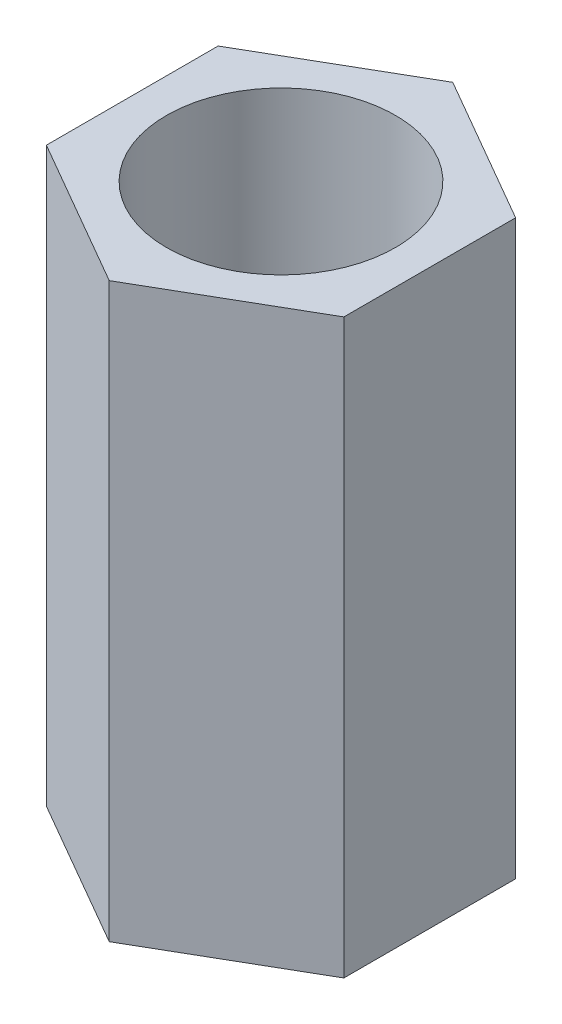
ISO-10303-21;
HEADER;
FILE_DESCRIPTION(('STEP AP214'),'2;1');
FILE_NAME('part.step','',(''),(''),'','','');
FILE_SCHEMA(('AUTOMOTIVE_DESIGN { 1 0 10303 214 1 1 1 1 }'));
ENDSEC;
DATA;
#1=APPLICATION_CONTEXT('core data for automotive mechanical design processes');
#2=APPLICATION_PROTOCOL_DEFINITION('international standard','automotive_design',2000,#1);
#3=PRODUCT_CONTEXT('',#1,'mechanical');
#4=PRODUCT('Part','Part','',(#3));
#5=PRODUCT_RELATED_PRODUCT_CATEGORY('part','',(#4));
#6=PRODUCT_DEFINITION_FORMATION('','',#4);
#7=PRODUCT_DEFINITION_CONTEXT('part definition',#1,'design');
#8=PRODUCT_DEFINITION('design','',#6,#7);
#9=PRODUCT_DEFINITION_SHAPE('','',#8);
#10=(LENGTH_UNIT() NAMED_UNIT(*) SI_UNIT(.MILLI.,.METRE.));
#11=(NAMED_UNIT(*) PLANE_ANGLE_UNIT() SI_UNIT($,.RADIAN.));
#12=(NAMED_UNIT(*) SI_UNIT($,.STERADIAN.) SOLID_ANGLE_UNIT());
#13=UNCERTAINTY_MEASURE_WITH_UNIT(LENGTH_MEASURE(1.E-05),#10,'distance_accuracy_value','');
#14=(GEOMETRIC_REPRESENTATION_CONTEXT(3) GLOBAL_UNCERTAINTY_ASSIGNED_CONTEXT((#13)) GLOBAL_UNIT_ASSIGNED_CONTEXT((#10,
#11,#12)) REPRESENTATION_CONTEXT('',''));
#15=CARTESIAN_POINT('',(0.,0.,0.));
#16=DIRECTION('',(0.,0.,1.));
#17=DIRECTION('',(1.,0.,0.));
#18=AXIS2_PLACEMENT_3D('',#15,#16,#17);
#19=CARTESIAN_POINT('',(0.,10.,0.));
#20=DIRECTION('',(0.,1.,0.));
#21=DIRECTION('',(0.,0.,1.));
#22=AXIS2_PLACEMENT_3D('',#19,#20,#21);
#23=PLANE('',#22);
#24=DIRECTION('',(-0.866025403784439,0.,-0.5));
#25=VECTOR('',#24,1.);
#26=CARTESIAN_POINT('',(2.59807621135331,10.,-1.5));
#27=LINE('',#26,#25);
#28=CARTESIAN_POINT('',(2.59807621135331,10.,-1.5));
#29=VERTEX_POINT('',#28);
#30=CARTESIAN_POINT('',(0.,10.,-3.));
#31=VERTEX_POINT('',#30);
#32=EDGE_CURVE('E150',#29,#31,#27,.T.);
#33=ORIENTED_EDGE('',*,*,#32,.T.);
#34=DIRECTION('',(-0.866025403784439,0.,0.5));
#35=VECTOR('',#34,1.);
#36=CARTESIAN_POINT('',(0.,10.,-3.));
#37=LINE('',#36,#35);
#38=CARTESIAN_POINT('',(-2.59807621135332,10.,-1.5));
#39=VERTEX_POINT('',#38);
#40=EDGE_CURVE('E98',#31,#39,#37,.T.);
#41=ORIENTED_EDGE('',*,*,#40,.T.);
#42=DIRECTION('',(0.,0.,1.));
#43=VECTOR('',#42,1.);
#44=CARTESIAN_POINT('',(-2.59807621135332,10.,-1.5));
#45=LINE('',#44,#43);
#46=CARTESIAN_POINT('',(-2.59807621135332,10.,1.5));
#47=VERTEX_POINT('',#46);
#48=EDGE_CURVE('E111',#39,#47,#45,.T.);
#49=ORIENTED_EDGE('',*,*,#48,.T.);
#50=DIRECTION('',(0.866025403784439,0.,0.5));
#51=VECTOR('',#50,1.);
#52=CARTESIAN_POINT('',(-2.59807621135332,10.,1.5));
#53=LINE('',#52,#51);
#54=CARTESIAN_POINT('',(0.,10.,3.));
#55=VERTEX_POINT('',#54);
#56=EDGE_CURVE('E105',#47,#55,#53,.T.);
#57=ORIENTED_EDGE('',*,*,#56,.T.);
#58=DIRECTION('',(0.866025403784439,0.,-0.5));
#59=VECTOR('',#58,1.);
#60=CARTESIAN_POINT('',(0.,10.,3.));
#61=LINE('',#60,#59);
#62=CARTESIAN_POINT('',(2.59807621135332,10.,1.5));
#63=VERTEX_POINT('',#62);
#64=EDGE_CURVE('E109',#55,#63,#61,.T.);
#65=ORIENTED_EDGE('',*,*,#64,.T.);
#66=DIRECTION('',(0.,0.,-1.));
#67=VECTOR('',#66,1.);
#68=CARTESIAN_POINT('',(2.59807621135332,10.,1.5));
#69=LINE('',#68,#67);
#70=EDGE_CURVE('E61',#63,#29,#69,.T.);
#71=ORIENTED_EDGE('',*,*,#70,.T.);
#72=EDGE_LOOP('',(#33,#41,#49,#57,#65,#71));
#73=FACE_BOUND('',#72,.T.);
#74=CARTESIAN_POINT('',(0.,10.,0.));
#75=DIRECTION('',(0.,1.,0.));
#76=DIRECTION('',(0.,0.,1.));
#77=AXIS2_PLACEMENT_3D('',#74,#75,#76);
#78=CIRCLE('',#77,2.);
#79=CARTESIAN_POINT('',(0.,10.,2.));
#80=VERTEX_POINT('',#79);
#81=EDGE_CURVE('E138',#80,#80,#78,.T.);
#82=ORIENTED_EDGE('',*,*,#81,.F.);
#83=EDGE_LOOP('',(#82));
#84=FACE_BOUND('',#83,.T.);
#85=ADVANCED_FACE('F43',(#73,#84),#23,.T.);
#86=CARTESIAN_POINT('',(0.,0.,0.));
#87=DIRECTION('',(0.,1.,0.));
#88=DIRECTION('',(0.,0.,1.));
#89=AXIS2_PLACEMENT_3D('',#86,#87,#88);
#90=PLANE('',#89);
#91=DIRECTION('',(-0.866025403784439,0.,-0.5));
#92=VECTOR('',#91,1.);
#93=CARTESIAN_POINT('',(2.59807621135331,0.,-1.5));
#94=LINE('',#93,#92);
#95=CARTESIAN_POINT('',(2.59807621135331,0.,-1.5));
#96=VERTEX_POINT('',#95);
#97=CARTESIAN_POINT('',(0.,0.,-3.));
#98=VERTEX_POINT('',#97);
#99=EDGE_CURVE('E133',#96,#98,#94,.T.);
#100=ORIENTED_EDGE('',*,*,#99,.F.);
#101=DIRECTION('',(0.,0.,-1.));
#102=VECTOR('',#101,1.);
#103=CARTESIAN_POINT('',(2.59807621135332,0.,1.5));
#104=LINE('',#103,#102);
#105=CARTESIAN_POINT('',(2.59807621135332,0.,1.5));
#106=VERTEX_POINT('',#105);
#107=EDGE_CURVE('E90',#106,#96,#104,.T.);
#108=ORIENTED_EDGE('',*,*,#107,.F.);
#109=DIRECTION('',(0.866025403784439,0.,-0.5));
#110=VECTOR('',#109,1.);
#111=CARTESIAN_POINT('',(0.,0.,3.));
#112=LINE('',#111,#110);
#113=CARTESIAN_POINT('',(0.,0.,3.));
#114=VERTEX_POINT('',#113);
#115=EDGE_CURVE('E84',#114,#106,#112,.T.);
#116=ORIENTED_EDGE('',*,*,#115,.F.);
#117=DIRECTION('',(0.866025403784439,0.,0.5));
#118=VECTOR('',#117,1.);
#119=CARTESIAN_POINT('',(-2.59807621135332,0.,1.5));
#120=LINE('',#119,#118);
#121=CARTESIAN_POINT('',(-2.59807621135332,0.,1.5));
#122=VERTEX_POINT('',#121);
#123=EDGE_CURVE('E120',#122,#114,#120,.T.);
#124=ORIENTED_EDGE('',*,*,#123,.F.);
#125=DIRECTION('',(0.,0.,1.));
#126=VECTOR('',#125,1.);
#127=CARTESIAN_POINT('',(-2.59807621135332,0.,-1.5));
#128=LINE('',#127,#126);
#129=CARTESIAN_POINT('',(-2.59807621135332,0.,-1.5));
#130=VERTEX_POINT('',#129);
#131=EDGE_CURVE('E141',#130,#122,#128,.T.);
#132=ORIENTED_EDGE('',*,*,#131,.F.);
#133=DIRECTION('',(-0.866025403784439,0.,0.5));
#134=VECTOR('',#133,1.);
#135=CARTESIAN_POINT('',(0.,0.,-3.));
#136=LINE('',#135,#134);
#137=EDGE_CURVE('E137',#98,#130,#136,.T.);
#138=ORIENTED_EDGE('',*,*,#137,.F.);
#139=EDGE_LOOP('',(#100,#108,#116,#124,#132,#138));
#140=FACE_BOUND('',#139,.T.);
#141=CARTESIAN_POINT('',(0.,0.,0.));
#142=DIRECTION('',(0.,1.,0.));
#143=DIRECTION('',(0.,0.,1.));
#144=AXIS2_PLACEMENT_3D('',#141,#142,#143);
#145=CIRCLE('',#144,2.);
#146=CARTESIAN_POINT('',(0.,0.,2.));
#147=VERTEX_POINT('',#146);
#148=EDGE_CURVE('E265',#147,#147,#145,.T.);
#149=ORIENTED_EDGE('',*,*,#148,.T.);
#150=EDGE_LOOP('',(#149));
#151=FACE_BOUND('',#150,.T.);
#152=ADVANCED_FACE('F163',(#140,#151),#90,.F.);
#153=CARTESIAN_POINT('',(2.59807621135331,10.,-1.5));
#154=DIRECTION('',(-0.5,0.,0.866025403784439));
#155=DIRECTION('',(0.866025403784439,0.,0.5));
#156=AXIS2_PLACEMENT_3D('',#153,#154,#155);
#157=PLANE('',#156);
#158=ORIENTED_EDGE('',*,*,#99,.T.);
#159=DIRECTION('',(0.,-1.,0.));
#160=VECTOR('',#159,1.);
#161=CARTESIAN_POINT('',(0.,10.,-3.));
#162=LINE('',#161,#160);
#163=EDGE_CURVE('E11',#31,#98,#162,.T.);
#164=ORIENTED_EDGE('',*,*,#163,.F.);
#165=ORIENTED_EDGE('',*,*,#32,.F.);
#166=DIRECTION('',(0.,-1.,0.));
#167=VECTOR('',#166,1.);
#168=CARTESIAN_POINT('',(2.59807621135331,10.,-1.5));
#169=LINE('',#168,#167);
#170=EDGE_CURVE('E129',#29,#96,#169,.T.);
#171=ORIENTED_EDGE('',*,*,#170,.T.);
#172=EDGE_LOOP('',(#158,#164,#165,#171));
#173=FACE_BOUND('',#172,.T.);
#174=ADVANCED_FACE('F45',(#173),#157,.F.);
#175=CARTESIAN_POINT('',(0.,10.,-3.));
#176=DIRECTION('',(0.5,0.,0.866025403784439));
#177=DIRECTION('',(0.866025403784439,0.,-0.5));
#178=AXIS2_PLACEMENT_3D('',#175,#176,#177);
#179=PLANE('',#178);
#180=ORIENTED_EDGE('',*,*,#137,.T.);
#181=DIRECTION('',(0.,-1.,0.));
#182=VECTOR('',#181,1.);
#183=CARTESIAN_POINT('',(-2.59807621135332,10.,-1.5));
#184=LINE('',#183,#182);
#185=EDGE_CURVE('E53',#39,#130,#184,.T.);
#186=ORIENTED_EDGE('',*,*,#185,.F.);
#187=ORIENTED_EDGE('',*,*,#40,.F.);
#188=ORIENTED_EDGE('',*,*,#163,.T.);
#189=EDGE_LOOP('',(#180,#186,#187,#188));
#190=FACE_BOUND('',#189,.T.);
#191=ADVANCED_FACE('F188',(#190),#179,.F.);
#192=CARTESIAN_POINT('',(-2.59807621135332,10.,-1.5));
#193=DIRECTION('',(1.,0.,0.));
#194=DIRECTION('',(0.,0.,-1.));
#195=AXIS2_PLACEMENT_3D('',#192,#193,#194);
#196=PLANE('',#195);
#197=ORIENTED_EDGE('',*,*,#131,.T.);
#198=DIRECTION('',(0.,-1.,0.));
#199=VECTOR('',#198,1.);
#200=CARTESIAN_POINT('',(-2.59807621135332,10.,1.5));
#201=LINE('',#200,#199);
#202=EDGE_CURVE('E122',#47,#122,#201,.T.);
#203=ORIENTED_EDGE('',*,*,#202,.F.);
#204=ORIENTED_EDGE('',*,*,#48,.F.);
#205=ORIENTED_EDGE('',*,*,#185,.T.);
#206=EDGE_LOOP('',(#197,#203,#204,#205));
#207=FACE_BOUND('',#206,.T.);
#208=ADVANCED_FACE('F160',(#207),#196,.F.);
#209=CARTESIAN_POINT('',(-2.59807621135332,10.,1.5));
#210=DIRECTION('',(0.5,0.,-0.866025403784439));
#211=DIRECTION('',(-0.866025403784439,0.,-0.5));
#212=AXIS2_PLACEMENT_3D('',#209,#210,#211);
#213=PLANE('',#212);
#214=ORIENTED_EDGE('',*,*,#123,.T.);
#215=DIRECTION('',(0.,-1.,0.));
#216=VECTOR('',#215,1.);
#217=CARTESIAN_POINT('',(0.,10.,3.));
#218=LINE('',#217,#216);
#219=EDGE_CURVE('E117',#55,#114,#218,.T.);
#220=ORIENTED_EDGE('',*,*,#219,.F.);
#221=ORIENTED_EDGE('',*,*,#56,.F.);
#222=ORIENTED_EDGE('',*,*,#202,.T.);
#223=EDGE_LOOP('',(#214,#220,#221,#222));
#224=FACE_BOUND('',#223,.T.);
#225=ADVANCED_FACE('F118',(#224),#213,.F.);
#226=CARTESIAN_POINT('',(0.,10.,3.));
#227=DIRECTION('',(-0.5,0.,-0.866025403784439));
#228=DIRECTION('',(-0.866025403784439,0.,0.5));
#229=AXIS2_PLACEMENT_3D('',#226,#227,#228);
#230=PLANE('',#229);
#231=ORIENTED_EDGE('',*,*,#115,.T.);
#232=DIRECTION('',(0.,-1.,0.));
#233=VECTOR('',#232,1.);
#234=CARTESIAN_POINT('',(2.59807621135332,10.,1.5));
#235=LINE('',#234,#233);
#236=EDGE_CURVE('E123',#63,#106,#235,.T.);
#237=ORIENTED_EDGE('',*,*,#236,.F.);
#238=ORIENTED_EDGE('',*,*,#64,.F.);
#239=ORIENTED_EDGE('',*,*,#219,.T.);
#240=EDGE_LOOP('',(#231,#237,#238,#239));
#241=FACE_BOUND('',#240,.T.);
#242=ADVANCED_FACE('F125',(#241),#230,.F.);
#243=CARTESIAN_POINT('',(2.59807621135332,10.,1.5));
#244=DIRECTION('',(-1.,0.,0.));
#245=DIRECTION('',(0.,0.,1.));
#246=AXIS2_PLACEMENT_3D('',#243,#244,#245);
#247=PLANE('',#246);
#248=ORIENTED_EDGE('',*,*,#107,.T.);
#249=ORIENTED_EDGE('',*,*,#170,.F.);
#250=ORIENTED_EDGE('',*,*,#70,.F.);
#251=ORIENTED_EDGE('',*,*,#236,.T.);
#252=EDGE_LOOP('',(#248,#249,#250,#251));
#253=FACE_BOUND('',#252,.T.);
#254=ADVANCED_FACE('F168',(#253),#247,.F.);
#255=CARTESIAN_POINT('',(0.,10.,0.));
#256=DIRECTION('',(0.,-1.,0.));
#257=DIRECTION('',(0.,0.,-1.));
#258=AXIS2_PLACEMENT_3D('',#255,#256,#257);
#259=CYLINDRICAL_SURFACE('',#258,2.);
#260=ORIENTED_EDGE('',*,*,#81,.T.);
#261=EDGE_LOOP('',(#260));
#262=FACE_BOUND('',#261,.T.);
#263=ORIENTED_EDGE('',*,*,#148,.F.);
#264=EDGE_LOOP('',(#263));
#265=FACE_BOUND('',#264,.T.);
#266=ADVANCED_FACE('F170',(#262,#265),#259,.F.);
#267=CLOSED_SHELL('',(#85,#152,#174,#191,#208,#225,#242,#254,#266));
#268=MANIFOLD_SOLID_BREP('B2',#267);
#269=ADVANCED_BREP_SHAPE_REPRESENTATION('',(#18,#268),#14);
#270=SHAPE_DEFINITION_REPRESENTATION(#9,#269);
ENDSEC;
END-ISO-10303-21;
